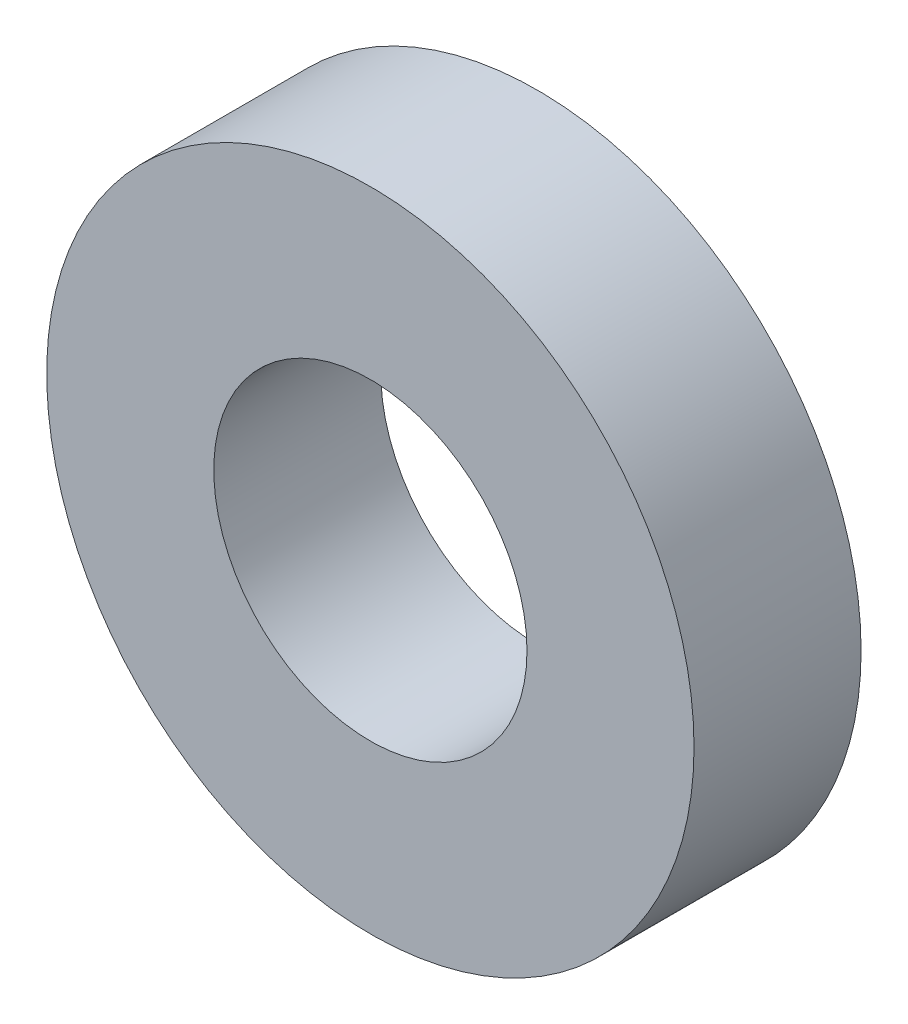
ISO-10303-21;
HEADER;
FILE_DESCRIPTION(('STEP AP214'),'2;1');
FILE_NAME('part.step','',(''),(''),'','','');
FILE_SCHEMA(('AUTOMOTIVE_DESIGN { 1 0 10303 214 1 1 1 1 }'));
ENDSEC;
DATA;
#1=APPLICATION_CONTEXT('core data for automotive mechanical design processes');
#2=APPLICATION_PROTOCOL_DEFINITION('international standard','automotive_design',2000,#1);
#3=PRODUCT_CONTEXT('',#1,'mechanical');
#4=PRODUCT('Part','Part','',(#3));
#5=PRODUCT_RELATED_PRODUCT_CATEGORY('part','',(#4));
#6=PRODUCT_DEFINITION_FORMATION('','',#4);
#7=PRODUCT_DEFINITION_CONTEXT('part definition',#1,'design');
#8=PRODUCT_DEFINITION('design','',#6,#7);
#9=PRODUCT_DEFINITION_SHAPE('','',#8);
#10=(LENGTH_UNIT() NAMED_UNIT(*) SI_UNIT(.MILLI.,.METRE.));
#11=(NAMED_UNIT(*) PLANE_ANGLE_UNIT() SI_UNIT($,.RADIAN.));
#12=(NAMED_UNIT(*) SI_UNIT($,.STERADIAN.) SOLID_ANGLE_UNIT());
#13=UNCERTAINTY_MEASURE_WITH_UNIT(LENGTH_MEASURE(1.E-05),#10,'distance_accuracy_value','');
#14=(GEOMETRIC_REPRESENTATION_CONTEXT(3) GLOBAL_UNCERTAINTY_ASSIGNED_CONTEXT((#13)) GLOBAL_UNIT_ASSIGNED_CONTEXT((#10,
#11,#12)) REPRESENTATION_CONTEXT('',''));
#15=CARTESIAN_POINT('',(0.,0.,0.));
#16=DIRECTION('',(0.,0.,1.));
#17=DIRECTION('',(1.,0.,0.));
#18=AXIS2_PLACEMENT_3D('',#15,#16,#17);
#19=CARTESIAN_POINT('',(0.,0.,16.));
#20=DIRECTION('',(0.,0.,-1.));
#21=DIRECTION('',(-1.,0.,0.));
#22=AXIS2_PLACEMENT_3D('',#19,#20,#21);
#23=CYLINDRICAL_SURFACE('',#22,31.);
#24=CARTESIAN_POINT('',(0.,0.,16.));
#25=DIRECTION('',(0.,0.,1.));
#26=DIRECTION('',(1.,0.,0.));
#27=AXIS2_PLACEMENT_3D('',#24,#25,#26);
#28=CIRCLE('',#27,31.);
#29=CARTESIAN_POINT('',(31.,0.,16.));
#30=VERTEX_POINT('',#29);
#31=EDGE_CURVE('E10',#30,#30,#28,.T.);
#32=ORIENTED_EDGE('',*,*,#31,.F.);
#33=EDGE_LOOP('',(#32));
#34=FACE_BOUND('',#33,.T.);
#35=CARTESIAN_POINT('',(0.,0.,0.));
#36=DIRECTION('',(0.,0.,1.));
#37=DIRECTION('',(1.,0.,0.));
#38=AXIS2_PLACEMENT_3D('',#35,#36,#37);
#39=CIRCLE('',#38,31.);
#40=CARTESIAN_POINT('',(31.,0.,0.));
#41=VERTEX_POINT('',#40);
#42=EDGE_CURVE('E36',#41,#41,#39,.T.);
#43=ORIENTED_EDGE('',*,*,#42,.T.);
#44=EDGE_LOOP('',(#43));
#45=FACE_BOUND('',#44,.T.);
#46=ADVANCED_FACE('F33',(#34,#45),#23,.T.);
#47=CARTESIAN_POINT('',(0.,0.,16.));
#48=DIRECTION('',(0.,0.,1.));
#49=DIRECTION('',(1.,0.,0.));
#50=AXIS2_PLACEMENT_3D('',#47,#48,#49);
#51=PLANE('',#50);
#52=CARTESIAN_POINT('',(0.,0.,16.));
#53=DIRECTION('',(0.,0.,1.));
#54=DIRECTION('',(1.,0.,0.));
#55=AXIS2_PLACEMENT_3D('',#52,#53,#54);
#56=CIRCLE('',#55,15.);
#57=CARTESIAN_POINT('',(15.,0.,16.));
#58=VERTEX_POINT('',#57);
#59=EDGE_CURVE('E43',#58,#58,#56,.T.);
#60=ORIENTED_EDGE('',*,*,#59,.F.);
#61=EDGE_LOOP('',(#60));
#62=FACE_BOUND('',#61,.T.);
#63=ORIENTED_EDGE('',*,*,#31,.T.);
#64=EDGE_LOOP('',(#63));
#65=FACE_BOUND('',#64,.T.);
#66=ADVANCED_FACE('F54',(#62,#65),#51,.T.);
#67=CARTESIAN_POINT('',(0.,0.,0.));
#68=DIRECTION('',(0.,0.,1.));
#69=DIRECTION('',(1.,0.,0.));
#70=AXIS2_PLACEMENT_3D('',#67,#68,#69);
#71=PLANE('',#70);
#72=CARTESIAN_POINT('',(0.,0.,0.));
#73=DIRECTION('',(0.,0.,1.));
#74=DIRECTION('',(1.,0.,0.));
#75=AXIS2_PLACEMENT_3D('',#72,#73,#74);
#76=CIRCLE('',#75,15.);
#77=CARTESIAN_POINT('',(15.,0.,0.));
#78=VERTEX_POINT('',#77);
#79=EDGE_CURVE('E45',#78,#78,#76,.T.);
#80=ORIENTED_EDGE('',*,*,#79,.T.);
#81=EDGE_LOOP('',(#80));
#82=FACE_BOUND('',#81,.T.);
#83=ORIENTED_EDGE('',*,*,#42,.F.);
#84=EDGE_LOOP('',(#83));
#85=FACE_BOUND('',#84,.T.);
#86=ADVANCED_FACE('F56',(#82,#85),#71,.F.);
#87=CARTESIAN_POINT('',(0.,0.,16.));
#88=DIRECTION('',(0.,0.,-1.));
#89=DIRECTION('',(-1.,0.,0.));
#90=AXIS2_PLACEMENT_3D('',#87,#88,#89);
#91=CYLINDRICAL_SURFACE('',#90,15.);
#92=ORIENTED_EDGE('',*,*,#59,.T.);
#93=EDGE_LOOP('',(#92));
#94=FACE_BOUND('',#93,.T.);
#95=ORIENTED_EDGE('',*,*,#79,.F.);
#96=EDGE_LOOP('',(#95));
#97=FACE_BOUND('',#96,.T.);
#98=ADVANCED_FACE('F51',(#94,#97),#91,.F.);
#99=CLOSED_SHELL('',(#46,#66,#86,#98));
#100=MANIFOLD_SOLID_BREP('B2',#99);
#101=ADVANCED_BREP_SHAPE_REPRESENTATION('',(#18,#100),#14);
#102=SHAPE_DEFINITION_REPRESENTATION(#9,#101);
ENDSEC;
END-ISO-10303-21;
